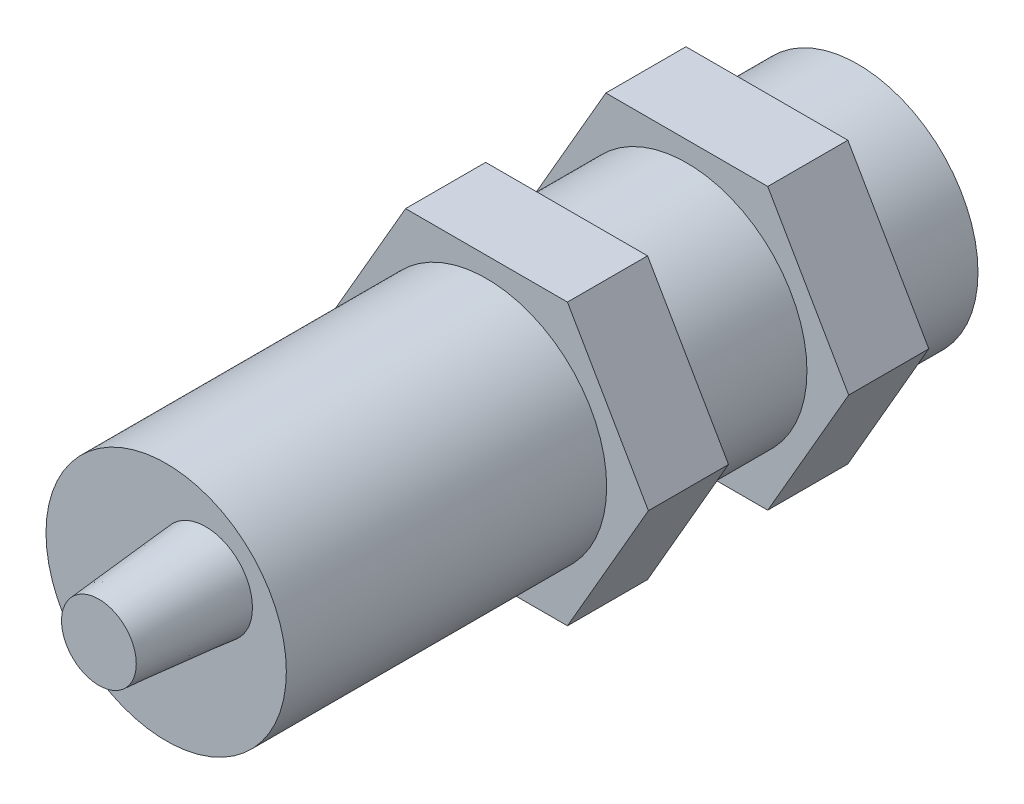
ISO-10303-21;
HEADER;
FILE_DESCRIPTION(('STEP AP214'),'2;1');
FILE_NAME('part.step','',(''),(''),'','','');
FILE_SCHEMA(('AUTOMOTIVE_DESIGN { 1 0 10303 214 1 1 1 1 }'));
ENDSEC;
DATA;
#1=APPLICATION_CONTEXT('core data for automotive mechanical design processes');
#2=APPLICATION_PROTOCOL_DEFINITION('international standard','automotive_design',2000,#1);
#3=PRODUCT_CONTEXT('',#1,'mechanical');
#4=PRODUCT('Part','Part','',(#3));
#5=PRODUCT_RELATED_PRODUCT_CATEGORY('part','',(#4));
#6=PRODUCT_DEFINITION_FORMATION('','',#4);
#7=PRODUCT_DEFINITION_CONTEXT('part definition',#1,'design');
#8=PRODUCT_DEFINITION('design','',#6,#7);
#9=PRODUCT_DEFINITION_SHAPE('','',#8);
#10=(LENGTH_UNIT() NAMED_UNIT(*) SI_UNIT(.MILLI.,.METRE.));
#11=(NAMED_UNIT(*) PLANE_ANGLE_UNIT() SI_UNIT($,.RADIAN.));
#12=(NAMED_UNIT(*) SI_UNIT($,.STERADIAN.) SOLID_ANGLE_UNIT());
#13=UNCERTAINTY_MEASURE_WITH_UNIT(LENGTH_MEASURE(1.E-05),#10,'distance_accuracy_value','');
#14=(GEOMETRIC_REPRESENTATION_CONTEXT(3) GLOBAL_UNCERTAINTY_ASSIGNED_CONTEXT((#13)) GLOBAL_UNIT_ASSIGNED_CONTEXT((#10,
#11,#12)) REPRESENTATION_CONTEXT('',''));
#15=CARTESIAN_POINT('',(0.,0.,0.));
#16=DIRECTION('',(0.,0.,1.));
#17=DIRECTION('',(1.,0.,0.));
#18=AXIS2_PLACEMENT_3D('',#15,#16,#17);
#19=CARTESIAN_POINT('',(0.,0.,51.8));
#20=DIRECTION('',(0.,0.,-1.));
#21=DIRECTION('',(-1.,0.,0.));
#22=AXIS2_PLACEMENT_3D('',#19,#20,#21);
#23=CYLINDRICAL_SURFACE('',#22,9.);
#24=CARTESIAN_POINT('',(0.,0.,21.81));
#25=DIRECTION('',(0.,0.,-1.));
#26=DIRECTION('',(-1.,0.,0.));
#27=AXIS2_PLACEMENT_3D('',#24,#25,#26);
#28=CIRCLE('',#27,9.);
#29=CARTESIAN_POINT('',(-9.,0.,21.81));
#30=VERTEX_POINT('',#29);
#31=EDGE_CURVE('E131',#30,#30,#28,.T.);
#32=CARTESIAN_POINT('',(0.,0.,12.81));
#33=DIRECTION('',(0.,0.,-1.));
#34=DIRECTION('',(-1.,0.,0.));
#35=AXIS2_PLACEMENT_3D('',#32,#33,#34);
#36=CIRCLE('',#35,9.);
#37=CARTESIAN_POINT('',(-9.,0.,12.81));
#38=VERTEX_POINT('',#37);
#39=EDGE_CURVE('E44',#38,#38,#36,.T.);
#40=CARTESIAN_POINT('',(-9.,0.,21.81));
#41=CARTESIAN_POINT('',(-9.,0.,21.71625));
#42=CARTESIAN_POINT('',(-9.,0.,21.6225));
#43=CARTESIAN_POINT('',(-9.,0.,21.435));
#44=CARTESIAN_POINT('',(-9.,0.,21.34125));
#45=CARTESIAN_POINT('',(-9.,0.,21.15375));
#46=CARTESIAN_POINT('',(-9.,0.,21.06));
#47=CARTESIAN_POINT('',(-9.,0.,20.8725));
#48=CARTESIAN_POINT('',(-9.,0.,20.77875));
#49=CARTESIAN_POINT('',(-9.,0.,20.59125));
#50=CARTESIAN_POINT('',(-9.,0.,20.4975));
#51=CARTESIAN_POINT('',(-9.,0.,20.31));
#52=CARTESIAN_POINT('',(-9.,0.,20.21625));
#53=CARTESIAN_POINT('',(-9.,0.,20.02875));
#54=CARTESIAN_POINT('',(-9.,0.,19.935));
#55=CARTESIAN_POINT('',(-9.,0.,19.7475));
#56=CARTESIAN_POINT('',(-9.,0.,19.65375));
#57=CARTESIAN_POINT('',(-9.,0.,19.46625));
#58=CARTESIAN_POINT('',(-9.,0.,19.3725));
#59=CARTESIAN_POINT('',(-9.,0.,19.185));
#60=CARTESIAN_POINT('',(-9.,0.,19.09125));
#61=CARTESIAN_POINT('',(-9.,0.,18.90375));
#62=CARTESIAN_POINT('',(-9.,0.,18.81));
#63=CARTESIAN_POINT('',(-9.,0.,18.6225));
#64=CARTESIAN_POINT('',(-9.,0.,18.52875));
#65=CARTESIAN_POINT('',(-9.,0.,18.34125));
#66=CARTESIAN_POINT('',(-9.,0.,18.2475));
#67=CARTESIAN_POINT('',(-9.,0.,18.06));
#68=CARTESIAN_POINT('',(-9.,0.,17.96625));
#69=CARTESIAN_POINT('',(-9.,0.,17.77875));
#70=CARTESIAN_POINT('',(-9.,0.,17.685));
#71=CARTESIAN_POINT('',(-9.,0.,17.4975));
#72=CARTESIAN_POINT('',(-9.,0.,17.40375));
#73=CARTESIAN_POINT('',(-9.,0.,17.21625));
#74=CARTESIAN_POINT('',(-9.,0.,17.1225));
#75=CARTESIAN_POINT('',(-9.,0.,16.935));
#76=CARTESIAN_POINT('',(-9.,0.,16.84125));
#77=CARTESIAN_POINT('',(-9.,0.,16.65375));
#78=CARTESIAN_POINT('',(-9.,0.,16.56));
#79=CARTESIAN_POINT('',(-9.,0.,16.3725));
#80=CARTESIAN_POINT('',(-9.,0.,16.27875));
#81=CARTESIAN_POINT('',(-9.,0.,16.09125));
#82=CARTESIAN_POINT('',(-9.,0.,15.9975));
#83=CARTESIAN_POINT('',(-9.,0.,15.81));
#84=CARTESIAN_POINT('',(-9.,0.,15.71625));
#85=CARTESIAN_POINT('',(-9.,0.,15.52875));
#86=CARTESIAN_POINT('',(-9.,0.,15.435));
#87=CARTESIAN_POINT('',(-9.,0.,15.2475));
#88=CARTESIAN_POINT('',(-9.,0.,15.15375));
#89=CARTESIAN_POINT('',(-9.,0.,14.96625));
#90=CARTESIAN_POINT('',(-9.,0.,14.8725));
#91=CARTESIAN_POINT('',(-9.,0.,14.685));
#92=CARTESIAN_POINT('',(-9.,0.,14.59125));
#93=CARTESIAN_POINT('',(-9.,0.,14.40375));
#94=CARTESIAN_POINT('',(-9.,0.,14.31));
#95=CARTESIAN_POINT('',(-9.,0.,14.1225));
#96=CARTESIAN_POINT('',(-9.,0.,14.02875));
#97=CARTESIAN_POINT('',(-9.,0.,13.84125));
#98=CARTESIAN_POINT('',(-9.,0.,13.7475));
#99=CARTESIAN_POINT('',(-9.,0.,13.56));
#100=CARTESIAN_POINT('',(-9.,0.,13.46625));
#101=CARTESIAN_POINT('',(-9.,0.,13.27875));
#102=CARTESIAN_POINT('',(-9.,0.,13.185));
#103=CARTESIAN_POINT('',(-9.,0.,12.9975));
#104=CARTESIAN_POINT('',(-9.,0.,12.90375));
#105=CARTESIAN_POINT('',(-9.,0.,12.81));
#106=B_SPLINE_CURVE_WITH_KNOTS('',3,(#40,#41,#42,#43,#44,#45,#46,#47,#48,#49,#50,#51,#52,#53,
#54,#55,#56,#57,#58,#59,#60,#61,#62,#63,#64,#65,#66,#67,#68,#69,#70,#71,#72,#73,#74,#75,#76,#77,
#78,#79,#80,#81,#82,#83,#84,#85,#86,#87,#88,#89,#90,#91,#92,#93,#94,#95,#96,#97,#98,#99,#100,
#101,#102,#103,#104,#105),.UNSPECIFIED.,.F.,.F.,(4,2,2,2,2,2,2,2,2,2,2,2,2,2,2,2,2,2,2,2,2,2,2,
2,2,2,2,2,2,2,2,2,4),(0.,0.28125,0.5625,0.843750000000001,1.125,1.40624999999999,1.6875,
1.96874999999999,2.25,2.53125,2.81249999999999,3.09375,3.37499999999999,3.65625,
3.93749999999999,4.21874999999999,4.49999999999999,4.78125,5.06249999999999,5.34374999999999,
5.62499999999999,5.90624999999999,6.18749999999999,6.46874999999999,6.74999999999999,
7.03124999999999,7.31249999999999,7.59374999999999,7.87499999999999,8.15624999999999,
8.43749999999999,8.71874999999999,8.99999999999999),.UNSPECIFIED.);
#107=EDGE_CURVE('BSEAM35',#30,#38,#106,.T.);
#108=ORIENTED_EDGE('',*,*,#31,.T.);
#109=ORIENTED_EDGE('',*,*,#39,.F.);
#110=ORIENTED_EDGE('',*,*,#107,.T.);
#111=ORIENTED_EDGE('',*,*,#107,.F.);
#112=EDGE_LOOP('',(#108,#110,#109,#111));
#113=FACE_BOUND('',#112,.T.);
#114=ADVANCED_FACE('F35',(#113),#23,.T.);
#115=CARTESIAN_POINT('',(-12.1243556529821,0.,12.81));
#116=DIRECTION('',(-0.866025403784438,0.5,0.));
#117=DIRECTION('',(-0.5,-0.866025403784439,0.));
#118=AXIS2_PLACEMENT_3D('',#115,#116,#117);
#119=PLANE('',#118);
#120=DIRECTION('',(0.5,0.866025403784439,0.));
#121=VECTOR('',#120,1.);
#122=CARTESIAN_POINT('',(-12.1243556529821,0.,6.81));
#123=LINE('',#122,#121);
#124=CARTESIAN_POINT('',(-12.1243556529821,0.,6.81));
#125=VERTEX_POINT('',#124);
#126=CARTESIAN_POINT('',(-6.06217782649107,10.5,6.81));
#127=VERTEX_POINT('',#126);
#128=EDGE_CURVE('E127',#125,#127,#123,.T.);
#129=ORIENTED_EDGE('',*,*,#128,.F.);
#130=DIRECTION('',(0.,0.,-1.));
#131=VECTOR('',#130,1.);
#132=CARTESIAN_POINT('',(-12.1243556529821,0.,12.81));
#133=LINE('',#132,#131);
#134=CARTESIAN_POINT('',(-12.1243556529821,0.,12.81));
#135=VERTEX_POINT('',#134);
#136=EDGE_CURVE('E52',#135,#125,#133,.T.);
#137=ORIENTED_EDGE('',*,*,#136,.F.);
#138=DIRECTION('',(0.5,0.866025403784439,0.));
#139=VECTOR('',#138,1.);
#140=CARTESIAN_POINT('',(-12.1243556529821,0.,12.81));
#141=LINE('',#140,#139);
#142=CARTESIAN_POINT('',(-6.06217782649107,10.5,12.81));
#143=VERTEX_POINT('',#142);
#144=EDGE_CURVE('E143',#135,#143,#141,.T.);
#145=ORIENTED_EDGE('',*,*,#144,.T.);
#146=DIRECTION('',(0.,0.,-1.));
#147=VECTOR('',#146,1.);
#148=CARTESIAN_POINT('',(-6.06217782649107,10.5,12.81));
#149=LINE('',#148,#147);
#150=EDGE_CURVE('E88',#143,#127,#149,.T.);
#151=ORIENTED_EDGE('',*,*,#150,.T.);
#152=EDGE_LOOP('',(#129,#137,#145,#151));
#153=FACE_BOUND('',#152,.T.);
#154=ADVANCED_FACE('F199',(#153),#119,.T.);
#155=CARTESIAN_POINT('',(-6.06217782649108,-10.5,12.81));
#156=DIRECTION('',(-0.866025403784438,-0.5,0.));
#157=DIRECTION('',(0.5,-0.866025403784439,0.));
#158=AXIS2_PLACEMENT_3D('',#155,#156,#157);
#159=PLANE('',#158);
#160=DIRECTION('',(-0.5,0.866025403784439,0.));
#161=VECTOR('',#160,1.);
#162=CARTESIAN_POINT('',(-6.06217782649108,-10.5,6.81));
#163=LINE('',#162,#161);
#164=CARTESIAN_POINT('',(-6.06217782649108,-10.5,6.81));
#165=VERTEX_POINT('',#164);
#166=EDGE_CURVE('E140',#165,#125,#163,.T.);
#167=ORIENTED_EDGE('',*,*,#166,.F.);
#168=DIRECTION('',(0.,0.,-1.));
#169=VECTOR('',#168,1.);
#170=CARTESIAN_POINT('',(-6.06217782649108,-10.5,12.81));
#171=LINE('',#170,#169);
#172=CARTESIAN_POINT('',(-6.06217782649108,-10.5,12.81));
#173=VERTEX_POINT('',#172);
#174=EDGE_CURVE('E76',#173,#165,#171,.T.);
#175=ORIENTED_EDGE('',*,*,#174,.F.);
#176=DIRECTION('',(-0.5,0.866025403784439,0.));
#177=VECTOR('',#176,1.);
#178=CARTESIAN_POINT('',(-6.06217782649108,-10.5,12.81));
#179=LINE('',#178,#177);
#180=EDGE_CURVE('E117',#173,#135,#179,.T.);
#181=ORIENTED_EDGE('',*,*,#180,.T.);
#182=ORIENTED_EDGE('',*,*,#136,.T.);
#183=EDGE_LOOP('',(#167,#175,#181,#182));
#184=FACE_BOUND('',#183,.T.);
#185=ADVANCED_FACE('F202',(#184),#159,.T.);
#186=CARTESIAN_POINT('',(6.06217782649107,-10.5,12.81));
#187=DIRECTION('',(0.,-1.,0.));
#188=DIRECTION('',(0.,0.,-1.));
#189=AXIS2_PLACEMENT_3D('',#186,#187,#188);
#190=PLANE('',#189);
#191=DIRECTION('',(-1.,0.,0.));
#192=VECTOR('',#191,1.);
#193=CARTESIAN_POINT('',(6.06217782649107,-10.5,6.81));
#194=LINE('',#193,#192);
#195=CARTESIAN_POINT('',(6.06217782649107,-10.5,6.81));
#196=VERTEX_POINT('',#195);
#197=EDGE_CURVE('E104',#196,#165,#194,.T.);
#198=ORIENTED_EDGE('',*,*,#197,.F.);
#199=DIRECTION('',(0.,0.,-1.));
#200=VECTOR('',#199,1.);
#201=CARTESIAN_POINT('',(6.06217782649107,-10.5,12.81));
#202=LINE('',#201,#200);
#203=CARTESIAN_POINT('',(6.06217782649107,-10.5,12.81));
#204=VERTEX_POINT('',#203);
#205=EDGE_CURVE('E99',#204,#196,#202,.T.);
#206=ORIENTED_EDGE('',*,*,#205,.F.);
#207=DIRECTION('',(-1.,0.,0.));
#208=VECTOR('',#207,1.);
#209=CARTESIAN_POINT('',(6.06217782649107,-10.5,12.81));
#210=LINE('',#209,#208);
#211=EDGE_CURVE('E102',#204,#173,#210,.T.);
#212=ORIENTED_EDGE('',*,*,#211,.T.);
#213=ORIENTED_EDGE('',*,*,#174,.T.);
#214=EDGE_LOOP('',(#198,#206,#212,#213));
#215=FACE_BOUND('',#214,.T.);
#216=ADVANCED_FACE('F101',(#215),#190,.T.);
#217=CARTESIAN_POINT('',(12.1243556529821,0.,12.81));
#218=DIRECTION('',(0.866025403784438,-0.5,0.));
#219=DIRECTION('',(0.5,0.866025403784439,0.));
#220=AXIS2_PLACEMENT_3D('',#217,#218,#219);
#221=PLANE('',#220);
#222=DIRECTION('',(-0.5,-0.866025403784439,0.));
#223=VECTOR('',#222,1.);
#224=CARTESIAN_POINT('',(12.1243556529821,0.,6.81));
#225=LINE('',#224,#223);
#226=CARTESIAN_POINT('',(12.1243556529821,0.,6.81));
#227=VERTEX_POINT('',#226);
#228=EDGE_CURVE('E137',#227,#196,#225,.T.);
#229=ORIENTED_EDGE('',*,*,#228,.F.);
#230=DIRECTION('',(0.,0.,-1.));
#231=VECTOR('',#230,1.);
#232=CARTESIAN_POINT('',(12.1243556529821,0.,12.81));
#233=LINE('',#232,#231);
#234=CARTESIAN_POINT('',(12.1243556529821,0.,12.81));
#235=VERTEX_POINT('',#234);
#236=EDGE_CURVE('E109',#235,#227,#233,.T.);
#237=ORIENTED_EDGE('',*,*,#236,.F.);
#238=DIRECTION('',(-0.5,-0.866025403784439,0.));
#239=VECTOR('',#238,1.);
#240=CARTESIAN_POINT('',(12.1243556529821,0.,12.81));
#241=LINE('',#240,#239);
#242=EDGE_CURVE('E115',#235,#204,#241,.T.);
#243=ORIENTED_EDGE('',*,*,#242,.T.);
#244=ORIENTED_EDGE('',*,*,#205,.T.);
#245=EDGE_LOOP('',(#229,#237,#243,#244));
#246=FACE_BOUND('',#245,.T.);
#247=ADVANCED_FACE('F119',(#246),#221,.T.);
#248=CARTESIAN_POINT('',(6.06217782649107,10.5,12.81));
#249=DIRECTION('',(0.866025403784439,0.5,0.));
#250=DIRECTION('',(-0.5,0.866025403784439,0.));
#251=AXIS2_PLACEMENT_3D('',#248,#249,#250);
#252=PLANE('',#251);
#253=DIRECTION('',(0.5,-0.866025403784438,0.));
#254=VECTOR('',#253,1.);
#255=CARTESIAN_POINT('',(6.06217782649107,10.5,6.81));
#256=LINE('',#255,#254);
#257=CARTESIAN_POINT('',(6.06217782649107,10.5,6.81));
#258=VERTEX_POINT('',#257);
#259=EDGE_CURVE('E134',#258,#227,#256,.T.);
#260=ORIENTED_EDGE('',*,*,#259,.F.);
#261=DIRECTION('',(0.,0.,-1.));
#262=VECTOR('',#261,1.);
#263=CARTESIAN_POINT('',(6.06217782649107,10.5,12.81));
#264=LINE('',#263,#262);
#265=CARTESIAN_POINT('',(6.06217782649107,10.5,12.81));
#266=VERTEX_POINT('',#265);
#267=EDGE_CURVE('E148',#266,#258,#264,.T.);
#268=ORIENTED_EDGE('',*,*,#267,.F.);
#269=DIRECTION('',(0.5,-0.866025403784438,0.));
#270=VECTOR('',#269,1.);
#271=CARTESIAN_POINT('',(6.06217782649107,10.5,12.81));
#272=LINE('',#271,#270);
#273=EDGE_CURVE('E120',#266,#235,#272,.T.);
#274=ORIENTED_EDGE('',*,*,#273,.T.);
#275=ORIENTED_EDGE('',*,*,#236,.T.);
#276=EDGE_LOOP('',(#260,#268,#274,#275));
#277=FACE_BOUND('',#276,.T.);
#278=ADVANCED_FACE('F338',(#277),#252,.T.);
#279=CARTESIAN_POINT('',(-6.06217782649107,10.5,12.81));
#280=DIRECTION('',(0.,1.,0.));
#281=DIRECTION('',(0.,0.,1.));
#282=AXIS2_PLACEMENT_3D('',#279,#280,#281);
#283=PLANE('',#282);
#284=DIRECTION('',(1.,0.,0.));
#285=VECTOR('',#284,1.);
#286=CARTESIAN_POINT('',(-6.06217782649107,10.5,6.81));
#287=LINE('',#286,#285);
#288=EDGE_CURVE('E130',#127,#258,#287,.T.);
#289=ORIENTED_EDGE('',*,*,#288,.F.);
#290=ORIENTED_EDGE('',*,*,#150,.F.);
#291=DIRECTION('',(1.,0.,0.));
#292=VECTOR('',#291,1.);
#293=CARTESIAN_POINT('',(-6.06217782649107,10.5,12.81));
#294=LINE('',#293,#292);
#295=EDGE_CURVE('E122',#143,#266,#294,.T.);
#296=ORIENTED_EDGE('',*,*,#295,.T.);
#297=ORIENTED_EDGE('',*,*,#267,.T.);
#298=EDGE_LOOP('',(#289,#290,#296,#297));
#299=FACE_BOUND('',#298,.T.);
#300=ADVANCED_FACE('F197',(#299),#283,.T.);
#301=CARTESIAN_POINT('',(0.,0.,12.81));
#302=DIRECTION('',(0.,0.,-1.));
#303=DIRECTION('',(-1.,0.,0.));
#304=AXIS2_PLACEMENT_3D('',#301,#302,#303);
#305=PLANE('',#304);
#306=ORIENTED_EDGE('',*,*,#39,.T.);
#307=EDGE_LOOP('',(#306));
#308=FACE_BOUND('',#307,.T.);
#309=ORIENTED_EDGE('',*,*,#144,.F.);
#310=ORIENTED_EDGE('',*,*,#180,.F.);
#311=ORIENTED_EDGE('',*,*,#211,.F.);
#312=ORIENTED_EDGE('',*,*,#242,.F.);
#313=ORIENTED_EDGE('',*,*,#273,.F.);
#314=ORIENTED_EDGE('',*,*,#295,.F.);
#315=EDGE_LOOP('',(#309,#310,#311,#312,#313,#314));
#316=FACE_BOUND('',#315,.T.);
#317=ADVANCED_FACE('F113',(#308,#316),#305,.F.);
#318=CARTESIAN_POINT('',(0.,0.,6.81));
#319=DIRECTION('',(0.,0.,-1.));
#320=DIRECTION('',(-1.,0.,0.));
#321=AXIS2_PLACEMENT_3D('',#318,#319,#320);
#322=PLANE('',#321);
#323=CARTESIAN_POINT('',(0.,0.,6.81));
#324=DIRECTION('',(0.,0.,-1.));
#325=DIRECTION('',(-1.,0.,0.));
#326=AXIS2_PLACEMENT_3D('',#323,#324,#325);
#327=CIRCLE('',#326,9.);
#328=CARTESIAN_POINT('',(-9.,0.,6.81));
#329=VERTEX_POINT('',#328);
#330=EDGE_CURVE('E145',#329,#329,#327,.T.);
#331=ORIENTED_EDGE('',*,*,#330,.F.);
#332=EDGE_LOOP('',(#331));
#333=FACE_BOUND('',#332,.T.);
#334=ORIENTED_EDGE('',*,*,#128,.T.);
#335=ORIENTED_EDGE('',*,*,#288,.T.);
#336=ORIENTED_EDGE('',*,*,#259,.T.);
#337=ORIENTED_EDGE('',*,*,#228,.T.);
#338=ORIENTED_EDGE('',*,*,#197,.T.);
#339=ORIENTED_EDGE('',*,*,#166,.T.);
#340=EDGE_LOOP('',(#334,#335,#336,#337,#338,#339));
#341=FACE_BOUND('',#340,.T.);
#342=ADVANCED_FACE('F201',(#333,#341),#322,.T.);
#343=CARTESIAN_POINT('',(0.,0.,0.));
#344=DIRECTION('',(0.,0.,1.));
#345=DIRECTION('',(1.,0.,0.));
#346=AXIS2_PLACEMENT_3D('',#343,#344,#345);
#347=PLANE('',#346);
#348=CARTESIAN_POINT('',(0.,0.,0.));
#349=DIRECTION('',(0.,0.,1.));
#350=DIRECTION('',(1.,0.,0.));
#351=AXIS2_PLACEMENT_3D('',#348,#349,#350);
#352=CIRCLE('',#351,9.);
#353=CARTESIAN_POINT('',(-9.,0.,0.));
#354=VERTEX_POINT('',#353);
#355=EDGE_CURVE('E157',#354,#354,#352,.T.);
#356=ORIENTED_EDGE('',*,*,#355,.F.);
#357=EDGE_LOOP('',(#356));
#358=FACE_BOUND('',#357,.T.);
#359=ADVANCED_FACE('F221',(#358),#347,.F.);
#360=CARTESIAN_POINT('',(-9.,0.,6.81));
#361=CARTESIAN_POINT('',(-9.,0.,6.7390625));
#362=CARTESIAN_POINT('',(-9.,0.,6.668125));
#363=CARTESIAN_POINT('',(-9.,0.,6.52625));
#364=CARTESIAN_POINT('',(-9.,0.,6.4553125));
#365=CARTESIAN_POINT('',(-9.,0.,6.3134375));
#366=CARTESIAN_POINT('',(-9.,0.,6.24250000000001));
#367=CARTESIAN_POINT('',(-9.,0.,6.10062500000001));
#368=CARTESIAN_POINT('',(-9.,0.,6.02968750000001));
#369=CARTESIAN_POINT('',(-9.,0.,5.8878125));
#370=CARTESIAN_POINT('',(-9.,0.,5.816875));
#371=CARTESIAN_POINT('',(-9.,0.,5.675));
#372=CARTESIAN_POINT('',(-9.,0.,5.6040625));
#373=CARTESIAN_POINT('',(-9.,0.,5.4621875));
#374=CARTESIAN_POINT('',(-9.,0.,5.39125));
#375=CARTESIAN_POINT('',(-9.,0.,5.249375));
#376=CARTESIAN_POINT('',(-9.,0.,5.1784375));
#377=CARTESIAN_POINT('',(-9.,0.,5.0365625));
#378=CARTESIAN_POINT('',(-9.,0.,4.965625));
#379=CARTESIAN_POINT('',(-9.,0.,4.82375));
#380=CARTESIAN_POINT('',(-9.,0.,4.7528125));
#381=CARTESIAN_POINT('',(-9.,0.,4.6109375));
#382=CARTESIAN_POINT('',(-9.,0.,4.54));
#383=CARTESIAN_POINT('',(-9.,0.,4.398125));
#384=CARTESIAN_POINT('',(-9.,0.,4.3271875));
#385=CARTESIAN_POINT('',(-9.,0.,4.1853125));
#386=CARTESIAN_POINT('',(-9.,0.,4.114375));
#387=CARTESIAN_POINT('',(-9.,0.,3.9725));
#388=CARTESIAN_POINT('',(-9.,0.,3.9015625));
#389=CARTESIAN_POINT('',(-9.,0.,3.7596875));
#390=CARTESIAN_POINT('',(-9.,0.,3.68875));
#391=CARTESIAN_POINT('',(-9.,0.,3.546875));
#392=CARTESIAN_POINT('',(-9.,0.,3.4759375));
#393=CARTESIAN_POINT('',(-9.,0.,3.3340625));
#394=CARTESIAN_POINT('',(-9.,0.,3.263125));
#395=CARTESIAN_POINT('',(-9.,0.,3.12125));
#396=CARTESIAN_POINT('',(-9.,0.,3.0503125));
#397=CARTESIAN_POINT('',(-9.,0.,2.9084375));
#398=CARTESIAN_POINT('',(-9.,0.,2.8375));
#399=CARTESIAN_POINT('',(-9.,0.,2.695625));
#400=CARTESIAN_POINT('',(-9.,0.,2.6246875));
#401=CARTESIAN_POINT('',(-9.,0.,2.4828125));
#402=CARTESIAN_POINT('',(-9.,0.,2.411875));
#403=CARTESIAN_POINT('',(-9.,0.,2.26999999999999));
#404=CARTESIAN_POINT('',(-9.,0.,2.19906249999999));
#405=CARTESIAN_POINT('',(-9.,0.,2.05718749999999));
#406=CARTESIAN_POINT('',(-9.,0.,1.98624999999999));
#407=CARTESIAN_POINT('',(-9.,0.,1.844375));
#408=CARTESIAN_POINT('',(-9.,0.,1.7734375));
#409=CARTESIAN_POINT('',(-9.,0.,1.6315625));
#410=CARTESIAN_POINT('',(-9.,0.,1.560625));
#411=CARTESIAN_POINT('',(-9.,0.,1.41875));
#412=CARTESIAN_POINT('',(-9.,0.,1.3478125));
#413=CARTESIAN_POINT('',(-9.,0.,1.2059375));
#414=CARTESIAN_POINT('',(-9.,0.,1.135));
#415=CARTESIAN_POINT('',(-9.,0.,0.993124999999995));
#416=CARTESIAN_POINT('',(-9.,0.,0.922187499999993));
#417=CARTESIAN_POINT('',(-9.,0.,0.780312499999991));
#418=CARTESIAN_POINT('',(-9.,0.,0.709374999999991));
#419=CARTESIAN_POINT('',(-9.,0.,0.567499999999992));
#420=CARTESIAN_POINT('',(-9.,0.,0.496562499999992));
#421=CARTESIAN_POINT('',(-9.,0.,0.354687499999992));
#422=CARTESIAN_POINT('',(-9.,0.,0.283749999999992));
#423=CARTESIAN_POINT('',(-9.,0.,0.141874999999993));
#424=CARTESIAN_POINT('',(-9.,0.,0.0709374999999928));
#425=CARTESIAN_POINT('',(-9.,0.,0.));
#426=B_SPLINE_CURVE_WITH_KNOTS('',3,(#360,#361,#362,#363,#364,#365,#366,#367,#368,#369,#370,
#371,#372,#373,#374,#375,#376,#377,#378,#379,#380,#381,#382,#383,#384,#385,#386,#387,#388,#389,
#390,#391,#392,#393,#394,#395,#396,#397,#398,#399,#400,#401,#402,#403,#404,#405,#406,#407,#408,
#409,#410,#411,#412,#413,#414,#415,#416,#417,#418,#419,#420,#421,#422,#423,#424,#425),
.UNSPECIFIED.,.F.,.F.,(4,2,2,2,2,2,2,2,2,2,2,2,2,2,2,2,2,2,2,2,2,2,2,2,2,2,2,2,2,2,2,2,4),(0.,
0.212812499999999,0.425624999999999,0.638437499999998,0.851249999999998,1.0640625,1.276875,
1.4896875,1.7025,1.9153125,2.128125,2.3409375,2.55375000000001,2.76656250000001,
2.97937500000001,3.19218750000001,3.40500000000001,3.6178125,3.830625,4.0434375,4.25625,
4.46906250000001,4.68187500000001,4.89468750000001,5.10750000000001,5.32031250000001,
5.53312500000001,5.74593750000001,5.95875000000001,6.17156250000001,6.38437500000001,
6.59718750000001,6.81000000000001),.UNSPECIFIED.);
#427=EDGE_CURVE('BSEAM37',#329,#354,#426,.T.);
#428=ORIENTED_EDGE('',*,*,#330,.T.);
#429=ORIENTED_EDGE('',*,*,#355,.T.);
#430=ORIENTED_EDGE('',*,*,#427,.T.);
#431=ORIENTED_EDGE('',*,*,#427,.F.);
#432=EDGE_LOOP('',(#428,#430,#429,#431));
#433=FACE_BOUND('',#432,.T.);
#434=ADVANCED_FACE('F37',(#433),#23,.T.);
#435=CARTESIAN_POINT('',(-12.1243556529821,0.,27.81));
#436=DIRECTION('',(-0.866025403784438,0.5,0.));
#437=DIRECTION('',(-0.5,-0.866025403784439,0.));
#438=AXIS2_PLACEMENT_3D('',#435,#436,#437);
#439=PLANE('',#438);
#440=DIRECTION('',(0.5,0.866025403784439,0.));
#441=VECTOR('',#440,1.);
#442=CARTESIAN_POINT('',(-12.1243556529821,0.,21.81));
#443=LINE('',#442,#441);
#444=CARTESIAN_POINT('',(-12.1243556529821,0.,21.81));
#445=VERTEX_POINT('',#444);
#446=CARTESIAN_POINT('',(-6.06217782649107,10.5,21.81));
#447=VERTEX_POINT('',#446);
#448=EDGE_CURVE('E265',#445,#447,#443,.T.);
#449=ORIENTED_EDGE('',*,*,#448,.F.);
#450=DIRECTION('',(0.,0.,-1.));
#451=VECTOR('',#450,1.);
#452=CARTESIAN_POINT('',(-12.1243556529821,0.,27.81));
#453=LINE('',#452,#451);
#454=CARTESIAN_POINT('',(-12.1243556529821,0.,27.81));
#455=VERTEX_POINT('',#454);
#456=EDGE_CURVE('E167',#455,#445,#453,.T.);
#457=ORIENTED_EDGE('',*,*,#456,.F.);
#458=DIRECTION('',(0.5,0.866025403784439,0.));
#459=VECTOR('',#458,1.);
#460=CARTESIAN_POINT('',(-12.1243556529821,0.,27.81));
#461=LINE('',#460,#459);
#462=CARTESIAN_POINT('',(-6.06217782649107,10.5,27.81));
#463=VERTEX_POINT('',#462);
#464=EDGE_CURVE('E246',#455,#463,#461,.T.);
#465=ORIENTED_EDGE('',*,*,#464,.T.);
#466=DIRECTION('',(0.,0.,-1.));
#467=VECTOR('',#466,1.);
#468=CARTESIAN_POINT('',(-6.06217782649107,10.5,27.81));
#469=LINE('',#468,#467);
#470=EDGE_CURVE('E193',#463,#447,#469,.T.);
#471=ORIENTED_EDGE('',*,*,#470,.T.);
#472=EDGE_LOOP('',(#449,#457,#465,#471));
#473=FACE_BOUND('',#472,.T.);
#474=ADVANCED_FACE('F220',(#473),#439,.T.);
#475=CARTESIAN_POINT('',(-6.06217782649108,-10.5,27.81));
#476=DIRECTION('',(-0.866025403784438,-0.5,0.));
#477=DIRECTION('',(0.5,-0.866025403784439,0.));
#478=AXIS2_PLACEMENT_3D('',#475,#476,#477);
#479=PLANE('',#478);
#480=DIRECTION('',(-0.5,0.866025403784439,0.));
#481=VECTOR('',#480,1.);
#482=CARTESIAN_POINT('',(-6.06217782649108,-10.5,21.81));
#483=LINE('',#482,#481);
#484=CARTESIAN_POINT('',(-6.06217782649108,-10.5,21.81));
#485=VERTEX_POINT('',#484);
#486=EDGE_CURVE('E182',#485,#445,#483,.T.);
#487=ORIENTED_EDGE('',*,*,#486,.F.);
#488=DIRECTION('',(0.,0.,-1.));
#489=VECTOR('',#488,1.);
#490=CARTESIAN_POINT('',(-6.06217782649108,-10.5,27.81));
#491=LINE('',#490,#489);
#492=CARTESIAN_POINT('',(-6.06217782649108,-10.5,27.81));
#493=VERTEX_POINT('',#492);
#494=EDGE_CURVE('E171',#493,#485,#491,.T.);
#495=ORIENTED_EDGE('',*,*,#494,.F.);
#496=DIRECTION('',(-0.5,0.866025403784439,0.));
#497=VECTOR('',#496,1.);
#498=CARTESIAN_POINT('',(-6.06217782649108,-10.5,27.81));
#499=LINE('',#498,#497);
#500=EDGE_CURVE('E196',#493,#455,#499,.T.);
#501=ORIENTED_EDGE('',*,*,#500,.T.);
#502=ORIENTED_EDGE('',*,*,#456,.T.);
#503=EDGE_LOOP('',(#487,#495,#501,#502));
#504=FACE_BOUND('',#503,.T.);
#505=ADVANCED_FACE('F257',(#504),#479,.T.);
#506=CARTESIAN_POINT('',(6.06217782649107,-10.5,27.81));
#507=DIRECTION('',(0.,-1.,0.));
#508=DIRECTION('',(0.,0.,-1.));
#509=AXIS2_PLACEMENT_3D('',#506,#507,#508);
#510=PLANE('',#509);
#511=DIRECTION('',(-1.,0.,0.));
#512=VECTOR('',#511,1.);
#513=CARTESIAN_POINT('',(6.06217782649107,-10.5,21.81));
#514=LINE('',#513,#512);
#515=CARTESIAN_POINT('',(6.06217782649107,-10.5,21.81));
#516=VERTEX_POINT('',#515);
#517=EDGE_CURVE('E276',#516,#485,#514,.T.);
#518=ORIENTED_EDGE('',*,*,#517,.F.);
#519=DIRECTION('',(0.,0.,-1.));
#520=VECTOR('',#519,1.);
#521=CARTESIAN_POINT('',(6.06217782649107,-10.5,27.81));
#522=LINE('',#521,#520);
#523=CARTESIAN_POINT('',(6.06217782649107,-10.5,27.81));
#524=VERTEX_POINT('',#523);
#525=EDGE_CURVE('E179',#524,#516,#522,.T.);
#526=ORIENTED_EDGE('',*,*,#525,.F.);
#527=DIRECTION('',(-1.,0.,0.));
#528=VECTOR('',#527,1.);
#529=CARTESIAN_POINT('',(6.06217782649107,-10.5,27.81));
#530=LINE('',#529,#528);
#531=EDGE_CURVE('E259',#524,#493,#530,.T.);
#532=ORIENTED_EDGE('',*,*,#531,.T.);
#533=ORIENTED_EDGE('',*,*,#494,.T.);
#534=EDGE_LOOP('',(#518,#526,#532,#533));
#535=FACE_BOUND('',#534,.T.);
#536=ADVANCED_FACE('F311',(#535),#510,.T.);
#537=CARTESIAN_POINT('',(12.1243556529821,0.,27.81));
#538=DIRECTION('',(0.866025403784438,-0.5,0.));
#539=DIRECTION('',(0.5,0.866025403784439,0.));
#540=AXIS2_PLACEMENT_3D('',#537,#538,#539);
#541=PLANE('',#540);
#542=DIRECTION('',(-0.5,-0.866025403784439,0.));
#543=VECTOR('',#542,1.);
#544=CARTESIAN_POINT('',(12.1243556529821,0.,21.81));
#545=LINE('',#544,#543);
#546=CARTESIAN_POINT('',(12.1243556529821,0.,21.81));
#547=VERTEX_POINT('',#546);
#548=EDGE_CURVE('E274',#547,#516,#545,.T.);
#549=ORIENTED_EDGE('',*,*,#548,.F.);
#550=DIRECTION('',(0.,0.,-1.));
#551=VECTOR('',#550,1.);
#552=CARTESIAN_POINT('',(12.1243556529821,0.,27.81));
#553=LINE('',#552,#551);
#554=CARTESIAN_POINT('',(12.1243556529821,0.,27.81));
#555=VERTEX_POINT('',#554);
#556=EDGE_CURVE('E187',#555,#547,#553,.T.);
#557=ORIENTED_EDGE('',*,*,#556,.F.);
#558=DIRECTION('',(-0.5,-0.866025403784439,0.));
#559=VECTOR('',#558,1.);
#560=CARTESIAN_POINT('',(12.1243556529821,0.,27.81));
#561=LINE('',#560,#559);
#562=EDGE_CURVE('E261',#555,#524,#561,.T.);
#563=ORIENTED_EDGE('',*,*,#562,.T.);
#564=ORIENTED_EDGE('',*,*,#525,.T.);
#565=EDGE_LOOP('',(#549,#557,#563,#564));
#566=FACE_BOUND('',#565,.T.);
#567=ADVANCED_FACE('F397',(#566),#541,.T.);
#568=CARTESIAN_POINT('',(6.06217782649107,10.5,27.81));
#569=DIRECTION('',(0.866025403784439,0.5,0.));
#570=DIRECTION('',(-0.5,0.866025403784439,0.));
#571=AXIS2_PLACEMENT_3D('',#568,#569,#570);
#572=PLANE('',#571);
#573=DIRECTION('',(0.5,-0.866025403784438,0.));
#574=VECTOR('',#573,1.);
#575=CARTESIAN_POINT('',(6.06217782649107,10.5,21.81));
#576=LINE('',#575,#574);
#577=CARTESIAN_POINT('',(6.06217782649107,10.5,21.81));
#578=VERTEX_POINT('',#577);
#579=EDGE_CURVE('E271',#578,#547,#576,.T.);
#580=ORIENTED_EDGE('',*,*,#579,.F.);
#581=DIRECTION('',(0.,0.,-1.));
#582=VECTOR('',#581,1.);
#583=CARTESIAN_POINT('',(6.06217782649107,10.5,27.81));
#584=LINE('',#583,#582);
#585=CARTESIAN_POINT('',(6.06217782649107,10.5,27.81));
#586=VERTEX_POINT('',#585);
#587=EDGE_CURVE('E190',#586,#578,#584,.T.);
#588=ORIENTED_EDGE('',*,*,#587,.F.);
#589=DIRECTION('',(0.5,-0.866025403784438,0.));
#590=VECTOR('',#589,1.);
#591=CARTESIAN_POINT('',(6.06217782649107,10.5,27.81));
#592=LINE('',#591,#590);
#593=EDGE_CURVE('E513',#586,#555,#592,.T.);
#594=ORIENTED_EDGE('',*,*,#593,.T.);
#595=ORIENTED_EDGE('',*,*,#556,.T.);
#596=EDGE_LOOP('',(#580,#588,#594,#595));
#597=FACE_BOUND('',#596,.T.);
#598=ADVANCED_FACE('F408',(#597),#572,.T.);
#599=CARTESIAN_POINT('',(-6.06217782649107,10.5,27.81));
#600=DIRECTION('',(0.,1.,0.));
#601=DIRECTION('',(0.,0.,1.));
#602=AXIS2_PLACEMENT_3D('',#599,#600,#601);
#603=PLANE('',#602);
#604=DIRECTION('',(1.,0.,0.));
#605=VECTOR('',#604,1.);
#606=CARTESIAN_POINT('',(-6.06217782649107,10.5,21.81));
#607=LINE('',#606,#605);
#608=EDGE_CURVE('E268',#447,#578,#607,.T.);
#609=ORIENTED_EDGE('',*,*,#608,.F.);
#610=ORIENTED_EDGE('',*,*,#470,.F.);
#611=DIRECTION('',(1.,0.,0.));
#612=VECTOR('',#611,1.);
#613=CARTESIAN_POINT('',(-6.06217782649107,10.5,27.81));
#614=LINE('',#613,#612);
#615=EDGE_CURVE('E252',#463,#586,#614,.T.);
#616=ORIENTED_EDGE('',*,*,#615,.T.);
#617=ORIENTED_EDGE('',*,*,#587,.T.);
#618=EDGE_LOOP('',(#609,#610,#616,#617));
#619=FACE_BOUND('',#618,.T.);
#620=ADVANCED_FACE('F240',(#619),#603,.T.);
#621=CARTESIAN_POINT('',(0.,0.,27.81));
#622=DIRECTION('',(0.,0.,-1.));
#623=DIRECTION('',(-1.,0.,0.));
#624=AXIS2_PLACEMENT_3D('',#621,#622,#623);
#625=PLANE('',#624);
#626=CARTESIAN_POINT('',(0.,0.,27.81));
#627=DIRECTION('',(0.,0.,-1.));
#628=DIRECTION('',(-1.,0.,0.));
#629=AXIS2_PLACEMENT_3D('',#626,#627,#628);
#630=CIRCLE('',#629,9.);
#631=CARTESIAN_POINT('',(-9.,0.,27.81));
#632=VERTEX_POINT('',#631);
#633=EDGE_CURVE('E11',#632,#632,#630,.T.);
#634=ORIENTED_EDGE('',*,*,#633,.T.);
#635=EDGE_LOOP('',(#634));
#636=FACE_BOUND('',#635,.T.);
#637=ORIENTED_EDGE('',*,*,#464,.F.);
#638=ORIENTED_EDGE('',*,*,#500,.F.);
#639=ORIENTED_EDGE('',*,*,#531,.F.);
#640=ORIENTED_EDGE('',*,*,#562,.F.);
#641=ORIENTED_EDGE('',*,*,#593,.F.);
#642=ORIENTED_EDGE('',*,*,#615,.F.);
#643=EDGE_LOOP('',(#637,#638,#639,#640,#641,#642));
#644=FACE_BOUND('',#643,.T.);
#645=ADVANCED_FACE('F236',(#636,#644),#625,.F.);
#646=CARTESIAN_POINT('',(0.,0.,21.81));
#647=DIRECTION('',(0.,0.,-1.));
#648=DIRECTION('',(-1.,0.,0.));
#649=AXIS2_PLACEMENT_3D('',#646,#647,#648);
#650=PLANE('',#649);
#651=ORIENTED_EDGE('',*,*,#31,.F.);
#652=EDGE_LOOP('',(#651));
#653=FACE_BOUND('',#652,.T.);
#654=ORIENTED_EDGE('',*,*,#448,.T.);
#655=ORIENTED_EDGE('',*,*,#608,.T.);
#656=ORIENTED_EDGE('',*,*,#579,.T.);
#657=ORIENTED_EDGE('',*,*,#548,.T.);
#658=ORIENTED_EDGE('',*,*,#517,.T.);
#659=ORIENTED_EDGE('',*,*,#486,.T.);
#660=EDGE_LOOP('',(#654,#655,#656,#657,#658,#659));
#661=FACE_BOUND('',#660,.T.);
#662=ADVANCED_FACE('F239',(#653,#661),#650,.T.);
#663=CARTESIAN_POINT('',(2.96132326730199,2.87840621581772,59.8));
#664=DIRECTION('',(0.,0.,1.));
#665=DIRECTION('',(1.,0.,0.));
#666=AXIS2_PLACEMENT_3D('',#663,#664,#665);
#667=PLANE('',#666);
#668=CARTESIAN_POINT('',(2.96132326730199,2.87840621581772,59.8));
#669=DIRECTION('',(0.,0.,1.));
#670=DIRECTION('',(1.,0.,0.));
#671=AXIS2_PLACEMENT_3D('',#668,#669,#670);
#672=CIRCLE('',#671,2.80009069179261);
#673=CARTESIAN_POINT('',(5.7614139590946,2.87840621581772,59.8));
#674=VERTEX_POINT('',#673);
#675=EDGE_CURVE('E154',#674,#674,#672,.T.);
#676=ORIENTED_EDGE('',*,*,#675,.T.);
#677=EDGE_LOOP('',(#676));
#678=FACE_BOUND('',#677,.T.);
#679=ADVANCED_FACE('F331',(#678),#667,.T.);
#680=CARTESIAN_POINT('',(2.96132326730199,2.87840621581772,51.8));
#681=DIRECTION('',(0.,0.,-1.));
#682=DIRECTION('',(1.,0.,0.));
#683=AXIS2_PLACEMENT_3D('',#680,#681,#682);
#684=CONICAL_SURFACE('',#683,3.5,0.0872664625997167);
#685=ORIENTED_EDGE('',*,*,#675,.F.);
#686=EDGE_LOOP('',(#685));
#687=FACE_BOUND('',#686,.T.);
#688=CARTESIAN_POINT('',(2.96132326730199,2.87840621581772,51.8));
#689=DIRECTION('',(0.,0.,1.));
#690=DIRECTION('',(1.,0.,0.));
#691=AXIS2_PLACEMENT_3D('',#688,#689,#690);
#692=CIRCLE('',#691,3.5);
#693=CARTESIAN_POINT('',(6.46132326730199,2.87840621581772,51.8));
#694=VERTEX_POINT('',#693);
#695=EDGE_CURVE('E151',#694,#694,#692,.T.);
#696=ORIENTED_EDGE('',*,*,#695,.T.);
#697=EDGE_LOOP('',(#696));
#698=FACE_BOUND('',#697,.T.);
#699=ADVANCED_FACE('F229',(#687,#698),#684,.T.);
#700=CARTESIAN_POINT('',(0.,0.,51.8));
#701=DIRECTION('',(0.,0.,1.));
#702=DIRECTION('',(1.,0.,0.));
#703=AXIS2_PLACEMENT_3D('',#700,#701,#702);
#704=PLANE('',#703);
#705=ORIENTED_EDGE('',*,*,#695,.F.);
#706=EDGE_LOOP('',(#705));
#707=FACE_BOUND('',#706,.T.);
#708=CARTESIAN_POINT('',(0.,0.,51.8));
#709=DIRECTION('',(0.,0.,1.));
#710=DIRECTION('',(1.,0.,0.));
#711=AXIS2_PLACEMENT_3D('',#708,#709,#710);
#712=CIRCLE('',#711,9.);
#713=CARTESIAN_POINT('',(-9.,0.,51.8));
#714=VERTEX_POINT('',#713);
#715=EDGE_CURVE('E158',#714,#714,#712,.T.);
#716=ORIENTED_EDGE('',*,*,#715,.T.);
#717=EDGE_LOOP('',(#716));
#718=FACE_BOUND('',#717,.T.);
#719=ADVANCED_FACE('F223',(#707,#718),#704,.T.);
#720=CARTESIAN_POINT('',(-9.,0.,51.8));
#721=CARTESIAN_POINT('',(-9.,0.,51.5501041666667));
#722=CARTESIAN_POINT('',(-9.,0.,51.3002083333333));
#723=CARTESIAN_POINT('',(-9.,0.,50.8004166666667));
#724=CARTESIAN_POINT('',(-9.,0.,50.5505208333333));
#725=CARTESIAN_POINT('',(-9.,0.,50.0507291666667));
#726=CARTESIAN_POINT('',(-9.,0.,49.8008333333333));
#727=CARTESIAN_POINT('',(-9.,0.,49.3010416666667));
#728=CARTESIAN_POINT('',(-9.,0.,49.0511458333333));
#729=CARTESIAN_POINT('',(-9.,0.,48.5513541666667));
#730=CARTESIAN_POINT('',(-9.,0.,48.3014583333333));
#731=CARTESIAN_POINT('',(-9.,0.,47.8016666666667));
#732=CARTESIAN_POINT('',(-9.,0.,47.5517708333333));
#733=CARTESIAN_POINT('',(-9.,0.,47.0519791666667));
#734=CARTESIAN_POINT('',(-9.,0.,46.8020833333333));
#735=CARTESIAN_POINT('',(-9.,0.,46.3022916666667));
#736=CARTESIAN_POINT('',(-9.,0.,46.0523958333333));
#737=CARTESIAN_POINT('',(-9.,0.,45.5526041666667));
#738=CARTESIAN_POINT('',(-9.,0.,45.3027083333333));
#739=CARTESIAN_POINT('',(-9.,0.,44.8029166666667));
#740=CARTESIAN_POINT('',(-9.,0.,44.5530208333333));
#741=CARTESIAN_POINT('',(-9.,0.,44.0532291666667));
#742=CARTESIAN_POINT('',(-9.,0.,43.8033333333333));
#743=CARTESIAN_POINT('',(-9.,0.,43.3035416666667));
#744=CARTESIAN_POINT('',(-9.,0.,43.0536458333333));
#745=CARTESIAN_POINT('',(-9.,0.,42.5538541666667));
#746=CARTESIAN_POINT('',(-9.,0.,42.3039583333333));
#747=CARTESIAN_POINT('',(-9.,0.,41.8041666666667));
#748=CARTESIAN_POINT('',(-9.,0.,41.5542708333333));
#749=CARTESIAN_POINT('',(-9.,0.,41.0544791666667));
#750=CARTESIAN_POINT('',(-9.,0.,40.8045833333333));
#751=CARTESIAN_POINT('',(-9.,0.,40.3047916666667));
#752=CARTESIAN_POINT('',(-9.,0.,40.0548958333333));
#753=CARTESIAN_POINT('',(-9.,0.,39.5551041666667));
#754=CARTESIAN_POINT('',(-9.,0.,39.3052083333333));
#755=CARTESIAN_POINT('',(-9.,0.,38.8054166666667));
#756=CARTESIAN_POINT('',(-9.,0.,38.5555208333333));
#757=CARTESIAN_POINT('',(-9.,0.,38.0557291666667));
#758=CARTESIAN_POINT('',(-9.,0.,37.8058333333333));
#759=CARTESIAN_POINT('',(-9.,0.,37.3060416666667));
#760=CARTESIAN_POINT('',(-9.,0.,37.0561458333333));
#761=CARTESIAN_POINT('',(-9.,0.,36.5563541666667));
#762=CARTESIAN_POINT('',(-9.,0.,36.3064583333333));
#763=CARTESIAN_POINT('',(-9.,0.,35.8066666666667));
#764=CARTESIAN_POINT('',(-9.,0.,35.5567708333333));
#765=CARTESIAN_POINT('',(-9.,0.,35.0569791666667));
#766=CARTESIAN_POINT('',(-9.,0.,34.8070833333333));
#767=CARTESIAN_POINT('',(-9.,0.,34.3072916666667));
#768=CARTESIAN_POINT('',(-9.,0.,34.0573958333333));
#769=CARTESIAN_POINT('',(-9.,0.,33.5576041666667));
#770=CARTESIAN_POINT('',(-9.,0.,33.3077083333333));
#771=CARTESIAN_POINT('',(-9.,0.,32.8079166666667));
#772=CARTESIAN_POINT('',(-9.,0.,32.5580208333333));
#773=CARTESIAN_POINT('',(-9.,0.,32.0582291666667));
#774=CARTESIAN_POINT('',(-9.,0.,31.8083333333333));
#775=CARTESIAN_POINT('',(-9.,0.,31.3085416666667));
#776=CARTESIAN_POINT('',(-9.,0.,31.0586458333333));
#777=CARTESIAN_POINT('',(-9.,0.,30.5588541666667));
#778=CARTESIAN_POINT('',(-9.,0.,30.3089583333333));
#779=CARTESIAN_POINT('',(-9.,0.,29.8091666666667));
#780=CARTESIAN_POINT('',(-9.,0.,29.5592708333333));
#781=CARTESIAN_POINT('',(-9.,0.,29.0594791666667));
#782=CARTESIAN_POINT('',(-9.,0.,28.8095833333333));
#783=CARTESIAN_POINT('',(-9.,0.,28.3097916666667));
#784=CARTESIAN_POINT('',(-9.,0.,28.0598958333333));
#785=CARTESIAN_POINT('',(-9.,0.,27.81));
#786=B_SPLINE_CURVE_WITH_KNOTS('',3,(#720,#721,#722,#723,#724,#725,#726,#727,#728,#729,#730,
#731,#732,#733,#734,#735,#736,#737,#738,#739,#740,#741,#742,#743,#744,#745,#746,#747,#748,#749,
#750,#751,#752,#753,#754,#755,#756,#757,#758,#759,#760,#761,#762,#763,#764,#765,#766,#767,#768,
#769,#770,#771,#772,#773,#774,#775,#776,#777,#778,#779,#780,#781,#782,#783,#784,#785),
.UNSPECIFIED.,.F.,.F.,(4,2,2,2,2,2,2,2,2,2,2,2,2,2,2,2,2,2,2,2,2,2,2,2,2,2,2,2,2,2,2,2,4),(0.,
0.749687500000006,1.499375,2.2490625,2.99875,3.7484375,4.498125,5.2478125,5.9975,6.7471875,
7.496875,8.2465625,8.99625,9.7459375,10.495625,11.2453125,11.995,12.7446875,13.494375,
14.2440625,14.99375,15.7434375,16.493125,17.2428125,17.9925,18.7421875,19.491875,20.2415625,
20.99125,21.7409375,22.490625,23.2403125,23.99),.UNSPECIFIED.);
#787=EDGE_CURVE('BSEAM213',#714,#632,#786,.T.);
#788=ORIENTED_EDGE('',*,*,#715,.F.);
#789=ORIENTED_EDGE('',*,*,#633,.F.);
#790=ORIENTED_EDGE('',*,*,#787,.T.);
#791=ORIENTED_EDGE('',*,*,#787,.F.);
#792=EDGE_LOOP('',(#788,#790,#789,#791));
#793=FACE_BOUND('',#792,.T.);
#794=ADVANCED_FACE('F213',(#793),#23,.T.);
#795=CLOSED_SHELL('',(#114,#154,#185,#216,#247,#278,#300,#317,#342,#359,#434,#474,#505,#536,
#567,#598,#620,#645,#662,#679,#699,#719,#794));
#796=MANIFOLD_SOLID_BREP('B2',#795);
#797=ADVANCED_BREP_SHAPE_REPRESENTATION('',(#18,#796),#14);
#798=SHAPE_DEFINITION_REPRESENTATION(#9,#797);
ENDSEC;
END-ISO-10303-21;
